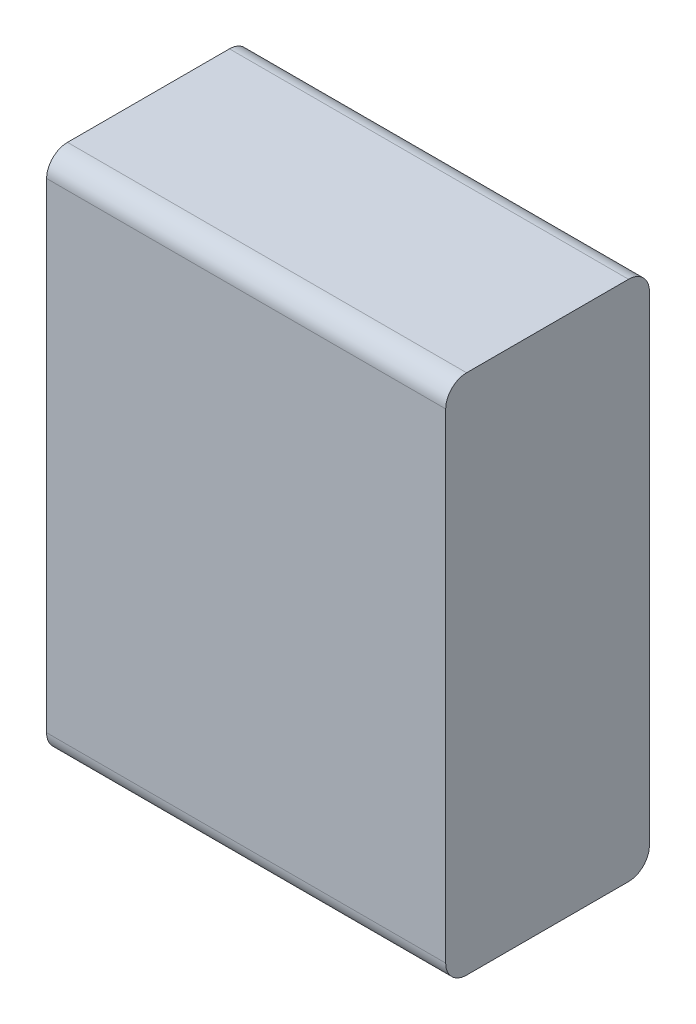
ISO-10303-21;
HEADER;
FILE_DESCRIPTION(('STEP AP214'),'2;1');
FILE_NAME('part.step','',(''),(''),'','','');
FILE_SCHEMA(('AUTOMOTIVE_DESIGN { 1 0 10303 214 1 1 1 1 }'));
ENDSEC;
DATA;
#1=APPLICATION_CONTEXT('core data for automotive mechanical design processes');
#2=APPLICATION_PROTOCOL_DEFINITION('international standard','automotive_design',2000,#1);
#3=PRODUCT_CONTEXT('',#1,'mechanical');
#4=PRODUCT('Part','Part','',(#3));
#5=PRODUCT_RELATED_PRODUCT_CATEGORY('part','',(#4));
#6=PRODUCT_DEFINITION_FORMATION('','',#4);
#7=PRODUCT_DEFINITION_CONTEXT('part definition',#1,'design');
#8=PRODUCT_DEFINITION('design','',#6,#7);
#9=PRODUCT_DEFINITION_SHAPE('','',#8);
#10=(LENGTH_UNIT() NAMED_UNIT(*) SI_UNIT(.MILLI.,.METRE.));
#11=(NAMED_UNIT(*) PLANE_ANGLE_UNIT() SI_UNIT($,.RADIAN.));
#12=(NAMED_UNIT(*) SI_UNIT($,.STERADIAN.) SOLID_ANGLE_UNIT());
#13=UNCERTAINTY_MEASURE_WITH_UNIT(LENGTH_MEASURE(1.E-05),#10,'distance_accuracy_value','');
#14=(GEOMETRIC_REPRESENTATION_CONTEXT(3) GLOBAL_UNCERTAINTY_ASSIGNED_CONTEXT((#13)) GLOBAL_UNIT_ASSIGNED_CONTEXT((#10,
#11,#12)) REPRESENTATION_CONTEXT('',''));
#15=CARTESIAN_POINT('',(0.,0.,0.));
#16=DIRECTION('',(0.,0.,1.));
#17=DIRECTION('',(1.,0.,0.));
#18=AXIS2_PLACEMENT_3D('',#15,#16,#17);
#19=CARTESIAN_POINT('',(-1.912412742063,3.238538594622,5.4145036489));
#20=DIRECTION('',(-1.,0.,0.));
#21=DIRECTION('',(0.,-1.,0.));
#22=AXIS2_PLACEMENT_3D('',#19,#20,#21);
#23=PLANE('',#22);
#24=CARTESIAN_POINT('',(-1.912412742063,-2.3,3.25225182445));
#25=DIRECTION('',(-1.,0.,0.));
#26=DIRECTION('',(0.,-0.707106781186548,0.707106781186548));
#27=AXIS2_PLACEMENT_3D('',#24,#25,#26);
#28=CIRCLE('',#27,0.2);
#29=CARTESIAN_POINT('',(-1.912412742063,-2.5,3.25225182445));
#30=VERTEX_POINT('',#29);
#31=CARTESIAN_POINT('',(-1.912412742063,-2.3,3.45225182445));
#32=VERTEX_POINT('',#31);
#33=EDGE_CURVE('E11',#30,#32,#28,.T.);
#34=ORIENTED_EDGE('',*,*,#33,.T.);
#35=DIRECTION('',(0.,1.,0.));
#36=VECTOR('',#35,1.);
#37=CARTESIAN_POINT('',(-1.912412742063,2.869269297311,3.45225182445));
#38=LINE('',#37,#36);
#39=CARTESIAN_POINT('',(-1.912412742063,2.3,3.45225182445));
#40=VERTEX_POINT('',#39);
#41=EDGE_CURVE('E24',#32,#40,#38,.T.);
#42=ORIENTED_EDGE('',*,*,#41,.T.);
#43=CARTESIAN_POINT('',(-1.912412742063,2.3,3.25225182445));
#44=DIRECTION('',(-1.,0.,0.));
#45=DIRECTION('',(0.,0.707106781186548,0.707106781186548));
#46=AXIS2_PLACEMENT_3D('',#43,#44,#45);
#47=CIRCLE('',#46,0.2);
#48=CARTESIAN_POINT('',(-1.912412742063,2.5,3.25225182445));
#49=VERTEX_POINT('',#48);
#50=EDGE_CURVE('E99',#40,#49,#47,.T.);
#51=ORIENTED_EDGE('',*,*,#50,.T.);
#52=DIRECTION('',(0.,0.,-1.));
#53=VECTOR('',#52,1.);
#54=CARTESIAN_POINT('',(-1.912412742063,2.5,2.70725182445));
#55=LINE('',#54,#53);
#56=CARTESIAN_POINT('',(-1.912412742063,2.5,1.7));
#57=VERTEX_POINT('',#56);
#58=EDGE_CURVE('E128',#49,#57,#55,.T.);
#59=ORIENTED_EDGE('',*,*,#58,.T.);
#60=CARTESIAN_POINT('',(-1.912412742063,2.3,1.7));
#61=DIRECTION('',(-1.,0.,0.));
#62=DIRECTION('',(0.,0.707106781186548,-0.707106781186548));
#63=AXIS2_PLACEMENT_3D('',#60,#61,#62);
#64=CIRCLE('',#63,0.2);
#65=CARTESIAN_POINT('',(-1.912412742063,2.3,1.5));
#66=VERTEX_POINT('',#65);
#67=EDGE_CURVE('E126',#57,#66,#64,.T.);
#68=ORIENTED_EDGE('',*,*,#67,.T.);
#69=DIRECTION('',(0.,-1.,0.));
#70=VECTOR('',#69,1.);
#71=CARTESIAN_POINT('',(-1.912412742063,2.869269297311,1.5));
#72=LINE('',#71,#70);
#73=CARTESIAN_POINT('',(-1.912412742063,-2.3,1.5));
#74=VERTEX_POINT('',#73);
#75=EDGE_CURVE('E124',#66,#74,#72,.T.);
#76=ORIENTED_EDGE('',*,*,#75,.T.);
#77=CARTESIAN_POINT('',(-1.912412742063,-2.3,1.7));
#78=DIRECTION('',(-1.,0.,0.));
#79=DIRECTION('',(0.,-0.707106781186548,-0.707106781186548));
#80=AXIS2_PLACEMENT_3D('',#77,#78,#79);
#81=CIRCLE('',#80,0.2);
#82=CARTESIAN_POINT('',(-1.912412742063,-2.5,1.7));
#83=VERTEX_POINT('',#82);
#84=EDGE_CURVE('E122',#74,#83,#81,.T.);
#85=ORIENTED_EDGE('',*,*,#84,.T.);
#86=DIRECTION('',(0.,0.,1.));
#87=VECTOR('',#86,1.);
#88=CARTESIAN_POINT('',(-1.912412742063,-2.5,2.70725182445));
#89=LINE('',#88,#87);
#90=EDGE_CURVE('E120',#83,#30,#89,.T.);
#91=ORIENTED_EDGE('',*,*,#90,.T.);
#92=EDGE_LOOP('',(#34,#42,#51,#59,#68,#76,#85,#91));
#93=FACE_BOUND('',#92,.T.);
#94=ADVANCED_FACE('F17',(#93),#23,.T.);
#95=CARTESIAN_POINT('',(1.912412742063,-3.238538594622,5.4145036489));
#96=DIRECTION('',(1.,0.,0.));
#97=DIRECTION('',(0.,1.,0.));
#98=AXIS2_PLACEMENT_3D('',#95,#96,#97);
#99=PLANE('',#98);
#100=CARTESIAN_POINT('',(1.912412742063,-2.3,3.25225182445));
#101=DIRECTION('',(1.,0.,0.));
#102=DIRECTION('',(0.,-0.707106781186548,0.707106781186548));
#103=AXIS2_PLACEMENT_3D('',#100,#101,#102);
#104=CIRCLE('',#103,0.2);
#105=CARTESIAN_POINT('',(1.912412742063,-2.3,3.45225182445));
#106=VERTEX_POINT('',#105);
#107=CARTESIAN_POINT('',(1.912412742063,-2.5,3.25225182445));
#108=VERTEX_POINT('',#107);
#109=EDGE_CURVE('E118',#106,#108,#104,.T.);
#110=ORIENTED_EDGE('',*,*,#109,.T.);
#111=DIRECTION('',(0.,0.,-1.));
#112=VECTOR('',#111,1.);
#113=CARTESIAN_POINT('',(1.912412742063,-2.5,2.70725182445));
#114=LINE('',#113,#112);
#115=CARTESIAN_POINT('',(1.912412742063,-2.5,1.7));
#116=VERTEX_POINT('',#115);
#117=EDGE_CURVE('E116',#108,#116,#114,.T.);
#118=ORIENTED_EDGE('',*,*,#117,.T.);
#119=CARTESIAN_POINT('',(1.912412742063,-2.3,1.7));
#120=DIRECTION('',(1.,0.,0.));
#121=DIRECTION('',(0.,-0.707106781186548,-0.707106781186548));
#122=AXIS2_PLACEMENT_3D('',#119,#120,#121);
#123=CIRCLE('',#122,0.2);
#124=CARTESIAN_POINT('',(1.912412742063,-2.3,1.5));
#125=VERTEX_POINT('',#124);
#126=EDGE_CURVE('E114',#116,#125,#123,.T.);
#127=ORIENTED_EDGE('',*,*,#126,.T.);
#128=DIRECTION('',(0.,1.,0.));
#129=VECTOR('',#128,1.);
#130=CARTESIAN_POINT('',(1.912412742063,-0.369269297310772,1.5));
#131=LINE('',#130,#129);
#132=CARTESIAN_POINT('',(1.912412742063,2.3,1.5));
#133=VERTEX_POINT('',#132);
#134=EDGE_CURVE('E112',#125,#133,#131,.T.);
#135=ORIENTED_EDGE('',*,*,#134,.T.);
#136=CARTESIAN_POINT('',(1.912412742063,2.3,1.7));
#137=DIRECTION('',(1.,0.,0.));
#138=DIRECTION('',(0.,0.707106781186548,-0.707106781186548));
#139=AXIS2_PLACEMENT_3D('',#136,#137,#138);
#140=CIRCLE('',#139,0.2);
#141=CARTESIAN_POINT('',(1.912412742063,2.5,1.7));
#142=VERTEX_POINT('',#141);
#143=EDGE_CURVE('E110',#133,#142,#140,.T.);
#144=ORIENTED_EDGE('',*,*,#143,.T.);
#145=DIRECTION('',(0.,0.,1.));
#146=VECTOR('',#145,1.);
#147=CARTESIAN_POINT('',(1.912412742063,2.5,2.70725182445));
#148=LINE('',#147,#146);
#149=CARTESIAN_POINT('',(1.912412742063,2.5,3.25225182445));
#150=VERTEX_POINT('',#149);
#151=EDGE_CURVE('E84',#142,#150,#148,.T.);
#152=ORIENTED_EDGE('',*,*,#151,.T.);
#153=CARTESIAN_POINT('',(1.912412742063,2.3,3.25225182445));
#154=DIRECTION('',(1.,0.,0.));
#155=DIRECTION('',(0.,0.707106781186548,0.707106781186548));
#156=AXIS2_PLACEMENT_3D('',#153,#154,#155);
#157=CIRCLE('',#156,0.2);
#158=CARTESIAN_POINT('',(1.912412742063,2.3,3.45225182445));
#159=VERTEX_POINT('',#158);
#160=EDGE_CURVE('E78',#150,#159,#157,.T.);
#161=ORIENTED_EDGE('',*,*,#160,.T.);
#162=DIRECTION('',(0.,-1.,0.));
#163=VECTOR('',#162,1.);
#164=CARTESIAN_POINT('',(1.912412742063,-0.369269297310772,3.45225182445));
#165=LINE('',#164,#163);
#166=EDGE_CURVE('E81',#159,#106,#165,.T.);
#167=ORIENTED_EDGE('',*,*,#166,.T.);
#168=EDGE_LOOP('',(#110,#118,#127,#135,#144,#152,#161,#167));
#169=FACE_BOUND('',#168,.T.);
#170=ADVANCED_FACE('F80',(#169),#99,.T.);
#171=CARTESIAN_POINT('',(3.,2.5,0.));
#172=DIRECTION('',(0.,1.,0.));
#173=DIRECTION('',(-1.,0.,0.));
#174=AXIS2_PLACEMENT_3D('',#171,#172,#173);
#175=PLANE('',#174);
#176=ORIENTED_EDGE('',*,*,#58,.F.);
#177=DIRECTION('',(-1.,0.,0.));
#178=VECTOR('',#177,1.);
#179=CARTESIAN_POINT('',(-0.519044189875,2.5,3.25225182445));
#180=LINE('',#179,#178);
#181=EDGE_CURVE('E95',#150,#49,#180,.T.);
#182=ORIENTED_EDGE('',*,*,#181,.F.);
#183=ORIENTED_EDGE('',*,*,#151,.F.);
#184=DIRECTION('',(1.,0.,0.));
#185=VECTOR('',#184,1.);
#186=CARTESIAN_POINT('',(2.8995,2.5,1.7));
#187=LINE('',#186,#185);
#188=EDGE_CURVE('E100',#57,#142,#187,.T.);
#189=ORIENTED_EDGE('',*,*,#188,.F.);
#190=EDGE_LOOP('',(#176,#182,#183,#189));
#191=FACE_BOUND('',#190,.T.);
#192=ADVANCED_FACE('F163',(#191),#175,.T.);
#193=CARTESIAN_POINT('',(-0.519044189875,2.3,3.25225182445));
#194=DIRECTION('',(1.,0.,0.));
#195=DIRECTION('',(0.,0.707106781186548,0.707106781186548));
#196=AXIS2_PLACEMENT_3D('',#193,#194,#195);
#197=CYLINDRICAL_SURFACE('',#196,0.2);
#198=ORIENTED_EDGE('',*,*,#50,.F.);
#199=DIRECTION('',(1.,0.,0.));
#200=VECTOR('',#199,1.);
#201=CARTESIAN_POINT('',(-0.519044189875,2.3,3.45225182445));
#202=LINE('',#201,#200);
#203=EDGE_CURVE('E93',#40,#159,#202,.T.);
#204=ORIENTED_EDGE('',*,*,#203,.T.);
#205=ORIENTED_EDGE('',*,*,#160,.F.);
#206=ORIENTED_EDGE('',*,*,#181,.T.);
#207=EDGE_LOOP('',(#198,#204,#205,#206));
#208=FACE_BOUND('',#207,.T.);
#209=ADVANCED_FACE('F98',(#208),#197,.T.);
#210=CARTESIAN_POINT('',(-4.03808837975,2.5,3.45225182445));
#211=DIRECTION('',(0.,0.,-1.));
#212=DIRECTION('',(1.,0.,0.));
#213=AXIS2_PLACEMENT_3D('',#210,#211,#212);
#214=PLANE('',#213);
#215=ORIENTED_EDGE('',*,*,#41,.F.);
#216=DIRECTION('',(-1.,0.,0.));
#217=VECTOR('',#216,1.);
#218=CARTESIAN_POINT('',(-3.519044189875,-2.3,3.45225182445));
#219=LINE('',#218,#217);
#220=EDGE_CURVE('E94',#106,#32,#219,.T.);
#221=ORIENTED_EDGE('',*,*,#220,.F.);
#222=ORIENTED_EDGE('',*,*,#166,.F.);
#223=ORIENTED_EDGE('',*,*,#203,.F.);
#224=EDGE_LOOP('',(#215,#221,#222,#223));
#225=FACE_BOUND('',#224,.T.);
#226=ADVANCED_FACE('F92',(#225),#214,.F.);
#227=CARTESIAN_POINT('',(-3.519044189875,-2.3,3.25225182445));
#228=DIRECTION('',(-1.,0.,0.));
#229=DIRECTION('',(0.,-0.707106781186548,0.707106781186548));
#230=AXIS2_PLACEMENT_3D('',#227,#228,#229);
#231=CYLINDRICAL_SURFACE('',#230,0.2);
#232=ORIENTED_EDGE('',*,*,#33,.F.);
#233=DIRECTION('',(1.,0.,0.));
#234=VECTOR('',#233,1.);
#235=CARTESIAN_POINT('',(-3.519044189875,-2.5,3.25225182445));
#236=LINE('',#235,#234);
#237=EDGE_CURVE('E104',#30,#108,#236,.T.);
#238=ORIENTED_EDGE('',*,*,#237,.T.);
#239=ORIENTED_EDGE('',*,*,#109,.F.);
#240=ORIENTED_EDGE('',*,*,#220,.T.);
#241=EDGE_LOOP('',(#232,#238,#239,#240));
#242=FACE_BOUND('',#241,.T.);
#243=ADVANCED_FACE('F131',(#242),#231,.T.);
#244=CARTESIAN_POINT('',(-0.1005,-2.3,1.7));
#245=DIRECTION('',(1.,0.,0.));
#246=DIRECTION('',(0.,-0.707106781186548,-0.707106781186548));
#247=AXIS2_PLACEMENT_3D('',#244,#245,#246);
#248=CYLINDRICAL_SURFACE('',#247,0.2);
#249=ORIENTED_EDGE('',*,*,#84,.F.);
#250=DIRECTION('',(1.,0.,0.));
#251=VECTOR('',#250,1.);
#252=CARTESIAN_POINT('',(-0.1005,-2.3,1.5));
#253=LINE('',#252,#251);
#254=EDGE_CURVE('E143',#74,#125,#253,.T.);
#255=ORIENTED_EDGE('',*,*,#254,.T.);
#256=ORIENTED_EDGE('',*,*,#126,.F.);
#257=DIRECTION('',(-1.,0.,0.));
#258=VECTOR('',#257,1.);
#259=CARTESIAN_POINT('',(-0.1005,-2.5,1.7));
#260=LINE('',#259,#258);
#261=EDGE_CURVE('E140',#116,#83,#260,.T.);
#262=ORIENTED_EDGE('',*,*,#261,.T.);
#263=EDGE_LOOP('',(#249,#255,#256,#262));
#264=FACE_BOUND('',#263,.T.);
#265=ADVANCED_FACE('F161',(#264),#248,.T.);
#266=CARTESIAN_POINT('',(2.8995,2.3,1.7));
#267=DIRECTION('',(-1.,0.,0.));
#268=DIRECTION('',(0.,0.707106781186548,-0.707106781186548));
#269=AXIS2_PLACEMENT_3D('',#266,#267,#268);
#270=CYLINDRICAL_SURFACE('',#269,0.2);
#271=ORIENTED_EDGE('',*,*,#67,.F.);
#272=ORIENTED_EDGE('',*,*,#188,.T.);
#273=ORIENTED_EDGE('',*,*,#143,.F.);
#274=DIRECTION('',(-1.,0.,0.));
#275=VECTOR('',#274,1.);
#276=CARTESIAN_POINT('',(2.8995,2.3,1.5));
#277=LINE('',#276,#275);
#278=EDGE_CURVE('E144',#133,#66,#277,.T.);
#279=ORIENTED_EDGE('',*,*,#278,.T.);
#280=EDGE_LOOP('',(#271,#272,#273,#279));
#281=FACE_BOUND('',#280,.T.);
#282=ADVANCED_FACE('F154',(#281),#270,.T.);
#283=CARTESIAN_POINT('',(2.799,2.5,1.5));
#284=DIRECTION('',(0.,0.,1.));
#285=DIRECTION('',(-1.,0.,0.));
#286=AXIS2_PLACEMENT_3D('',#283,#284,#285);
#287=PLANE('',#286);
#288=ORIENTED_EDGE('',*,*,#75,.F.);
#289=ORIENTED_EDGE('',*,*,#278,.F.);
#290=ORIENTED_EDGE('',*,*,#134,.F.);
#291=ORIENTED_EDGE('',*,*,#254,.F.);
#292=EDGE_LOOP('',(#288,#289,#290,#291));
#293=FACE_BOUND('',#292,.T.);
#294=ADVANCED_FACE('F159',(#293),#287,.F.);
#295=CARTESIAN_POINT('',(-3.,-2.5,0.));
#296=DIRECTION('',(0.,-1.,0.));
#297=DIRECTION('',(1.,0.,0.));
#298=AXIS2_PLACEMENT_3D('',#295,#296,#297);
#299=PLANE('',#298);
#300=ORIENTED_EDGE('',*,*,#90,.F.);
#301=ORIENTED_EDGE('',*,*,#261,.F.);
#302=ORIENTED_EDGE('',*,*,#117,.F.);
#303=ORIENTED_EDGE('',*,*,#237,.F.);
#304=EDGE_LOOP('',(#300,#301,#302,#303));
#305=FACE_BOUND('',#304,.T.);
#306=ADVANCED_FACE('F138',(#305),#299,.T.);
#307=CLOSED_SHELL('',(#94,#170,#192,#209,#226,#243,#265,#282,#294,#306));
#308=MANIFOLD_SOLID_BREP('B1',#307);
#309=ADVANCED_BREP_SHAPE_REPRESENTATION('',(#18,#308),#14);
#310=SHAPE_DEFINITION_REPRESENTATION(#9,#309);
ENDSEC;
END-ISO-10303-21;
